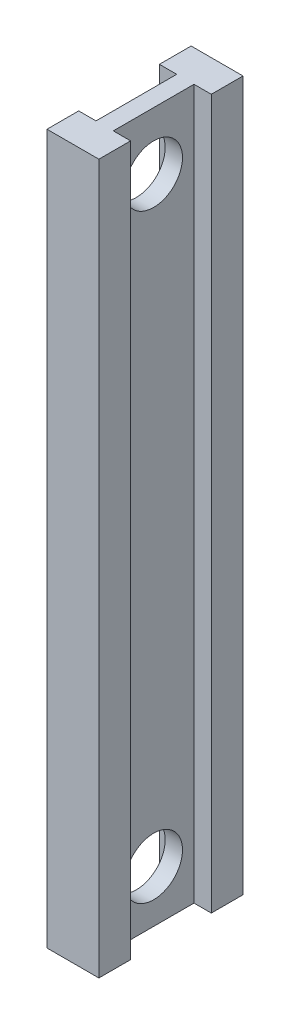
ISO-10303-21;
HEADER;
FILE_DESCRIPTION(('STEP AP214'),'2;1');
FILE_NAME('part.step','',(''),(''),'','','');
FILE_SCHEMA(('AUTOMOTIVE_DESIGN { 1 0 10303 214 1 1 1 1 }'));
ENDSEC;
DATA;
#1=APPLICATION_CONTEXT('core data for automotive mechanical design processes');
#2=APPLICATION_PROTOCOL_DEFINITION('international standard','automotive_design',2000,#1);
#3=PRODUCT_CONTEXT('',#1,'mechanical');
#4=PRODUCT('Part','Part','',(#3));
#5=PRODUCT_RELATED_PRODUCT_CATEGORY('part','',(#4));
#6=PRODUCT_DEFINITION_FORMATION('','',#4);
#7=PRODUCT_DEFINITION_CONTEXT('part definition',#1,'design');
#8=PRODUCT_DEFINITION('design','',#6,#7);
#9=PRODUCT_DEFINITION_SHAPE('','',#8);
#10=(LENGTH_UNIT() NAMED_UNIT(*) SI_UNIT(.MILLI.,.METRE.));
#11=(NAMED_UNIT(*) PLANE_ANGLE_UNIT() SI_UNIT($,.RADIAN.));
#12=(NAMED_UNIT(*) SI_UNIT($,.STERADIAN.) SOLID_ANGLE_UNIT());
#13=UNCERTAINTY_MEASURE_WITH_UNIT(LENGTH_MEASURE(1.E-05),#10,'distance_accuracy_value','');
#14=(GEOMETRIC_REPRESENTATION_CONTEXT(3) GLOBAL_UNCERTAINTY_ASSIGNED_CONTEXT((#13)) GLOBAL_UNIT_ASSIGNED_CONTEXT((#10,
#11,#12)) REPRESENTATION_CONTEXT('',''));
#15=CARTESIAN_POINT('',(0.,0.,0.));
#16=DIRECTION('',(0.,0.,1.));
#17=DIRECTION('',(1.,0.,0.));
#18=AXIS2_PLACEMENT_3D('',#15,#16,#17);
#19=CARTESIAN_POINT('',(33.7500000000001,1076.28491328611,52.5));
#20=DIRECTION('',(-1.,0.,0.));
#21=DIRECTION('',(0.,0.,1.));
#22=AXIS2_PLACEMENT_3D('',#19,#20,#21);
#23=PLANE('',#22);
#24=DIRECTION('',(0.,0.,-1.));
#25=VECTOR('',#24,1.);
#26=CARTESIAN_POINT('',(33.7500000000001,153.784913286111,52.5));
#27=LINE('',#26,#25);
#28=CARTESIAN_POINT('',(33.75,153.784913286111,93.75));
#29=VERTEX_POINT('',#28);
#30=CARTESIAN_POINT('',(33.7500000000001,153.784913286111,52.5));
#31=VERTEX_POINT('',#30);
#32=EDGE_CURVE('E168',#29,#31,#27,.T.);
#33=ORIENTED_EDGE('',*,*,#32,.T.);
#34=DIRECTION('',(0.,-1.,0.));
#35=VECTOR('',#34,1.);
#36=CARTESIAN_POINT('',(33.7500000000001,1076.28491328611,52.5));
#37=LINE('',#36,#35);
#38=CARTESIAN_POINT('',(33.7500000000001,1076.28491328611,52.5));
#39=VERTEX_POINT('',#38);
#40=EDGE_CURVE('E12',#39,#31,#37,.T.);
#41=ORIENTED_EDGE('',*,*,#40,.F.);
#42=DIRECTION('',(0.,0.,-1.));
#43=VECTOR('',#42,1.);
#44=CARTESIAN_POINT('',(33.7500000000001,1076.28491328611,52.5));
#45=LINE('',#44,#43);
#46=CARTESIAN_POINT('',(33.75,1076.28491328611,93.75));
#47=VERTEX_POINT('',#46);
#48=EDGE_CURVE('E195',#47,#39,#45,.T.);
#49=ORIENTED_EDGE('',*,*,#48,.F.);
#50=DIRECTION('',(0.,-1.,0.));
#51=VECTOR('',#50,1.);
#52=CARTESIAN_POINT('',(33.75,1076.28491328611,93.75));
#53=LINE('',#52,#51);
#54=EDGE_CURVE('E167',#47,#29,#53,.T.);
#55=ORIENTED_EDGE('',*,*,#54,.T.);
#56=EDGE_LOOP('',(#33,#41,#49,#55));
#57=FACE_BOUND('',#56,.T.);
#58=ADVANCED_FACE('F48',(#57),#23,.F.);
#59=CARTESIAN_POINT('',(33.7500000000001,1076.28491328611,52.5));
#60=DIRECTION('',(0.,0.,1.));
#61=DIRECTION('',(1.,0.,0.));
#62=AXIS2_PLACEMENT_3D('',#59,#60,#61);
#63=PLANE('',#62);
#64=DIRECTION('',(-1.,0.,0.));
#65=VECTOR('',#64,1.);
#66=CARTESIAN_POINT('',(33.7500000000001,153.784913286111,52.5));
#67=LINE('',#66,#65);
#68=CARTESIAN_POINT('',(11.25,153.784913286111,52.5));
#69=VERTEX_POINT('',#68);
#70=EDGE_CURVE('E175',#31,#69,#67,.T.);
#71=ORIENTED_EDGE('',*,*,#70,.T.);
#72=DIRECTION('',(0.,-1.,0.));
#73=VECTOR('',#72,1.);
#74=CARTESIAN_POINT('',(11.25,1076.28491328611,52.5));
#75=LINE('',#74,#73);
#76=CARTESIAN_POINT('',(11.25,1076.28491328611,52.5));
#77=VERTEX_POINT('',#76);
#78=EDGE_CURVE('E60',#77,#69,#75,.T.);
#79=ORIENTED_EDGE('',*,*,#78,.F.);
#80=DIRECTION('',(-1.,0.,0.));
#81=VECTOR('',#80,1.);
#82=CARTESIAN_POINT('',(33.7500000000001,1076.28491328611,52.5));
#83=LINE('',#82,#81);
#84=EDGE_CURVE('E124',#39,#77,#83,.T.);
#85=ORIENTED_EDGE('',*,*,#84,.F.);
#86=ORIENTED_EDGE('',*,*,#40,.T.);
#87=EDGE_LOOP('',(#71,#79,#85,#86));
#88=FACE_BOUND('',#87,.T.);
#89=ADVANCED_FACE('F268',(#88),#63,.F.);
#90=CARTESIAN_POINT('',(11.25,1076.28491328611,-52.5));
#91=DIRECTION('',(-1.,0.,0.));
#92=DIRECTION('',(0.,0.,1.));
#93=AXIS2_PLACEMENT_3D('',#90,#91,#92);
#94=PLANE('',#93);
#95=CARTESIAN_POINT('',(11.25,1001.28491328611,0.));
#96=DIRECTION('',(1.,0.,0.));
#97=DIRECTION('',(0.,0.,-1.));
#98=AXIS2_PLACEMENT_3D('',#95,#96,#97);
#99=CIRCLE('',#98,37.5);
#100=CARTESIAN_POINT('',(11.25,1001.28491328611,-37.5));
#101=VERTEX_POINT('',#100);
#102=EDGE_CURVE('E223',#101,#101,#99,.T.);
#103=ORIENTED_EDGE('',*,*,#102,.F.);
#104=EDGE_LOOP('',(#103));
#105=FACE_BOUND('',#104,.T.);
#106=CARTESIAN_POINT('',(11.25,221.284913286111,0.));
#107=DIRECTION('',(1.,0.,0.));
#108=DIRECTION('',(0.,0.,-1.));
#109=AXIS2_PLACEMENT_3D('',#106,#107,#108);
#110=CIRCLE('',#109,37.5);
#111=CARTESIAN_POINT('',(11.25,221.284913286111,-37.5));
#112=VERTEX_POINT('',#111);
#113=EDGE_CURVE('E220',#112,#112,#110,.T.);
#114=ORIENTED_EDGE('',*,*,#113,.F.);
#115=EDGE_LOOP('',(#114));
#116=FACE_BOUND('',#115,.T.);
#117=DIRECTION('',(0.,0.,-1.));
#118=VECTOR('',#117,1.);
#119=CARTESIAN_POINT('',(11.25,153.784913286111,-52.5));
#120=LINE('',#119,#118);
#121=CARTESIAN_POINT('',(11.25,153.784913286111,-52.5));
#122=VERTEX_POINT('',#121);
#123=EDGE_CURVE('E179',#69,#122,#120,.T.);
#124=ORIENTED_EDGE('',*,*,#123,.T.);
#125=DIRECTION('',(0.,-1.,0.));
#126=VECTOR('',#125,1.);
#127=CARTESIAN_POINT('',(11.25,1076.28491328611,-52.5));
#128=LINE('',#127,#126);
#129=CARTESIAN_POINT('',(11.25,1076.28491328611,-52.5));
#130=VERTEX_POINT('',#129);
#131=EDGE_CURVE('E215',#130,#122,#128,.T.);
#132=ORIENTED_EDGE('',*,*,#131,.F.);
#133=DIRECTION('',(0.,0.,-1.));
#134=VECTOR('',#133,1.);
#135=CARTESIAN_POINT('',(11.25,1076.28491328611,-52.5));
#136=LINE('',#135,#134);
#137=EDGE_CURVE('E228',#77,#130,#136,.T.);
#138=ORIENTED_EDGE('',*,*,#137,.F.);
#139=ORIENTED_EDGE('',*,*,#78,.T.);
#140=EDGE_LOOP('',(#124,#132,#138,#139));
#141=FACE_BOUND('',#140,.T.);
#142=ADVANCED_FACE('F275',(#105,#116,#141),#94,.F.);
#143=CARTESIAN_POINT('',(33.75,1076.28491328611,-52.5));
#144=DIRECTION('',(0.,0.,-1.));
#145=DIRECTION('',(-1.,0.,0.));
#146=AXIS2_PLACEMENT_3D('',#143,#144,#145);
#147=PLANE('',#146);
#148=DIRECTION('',(1.,0.,0.));
#149=VECTOR('',#148,1.);
#150=CARTESIAN_POINT('',(33.75,153.784913286111,-52.5));
#151=LINE('',#150,#149);
#152=CARTESIAN_POINT('',(33.75,153.784913286111,-52.5));
#153=VERTEX_POINT('',#152);
#154=EDGE_CURVE('E180',#122,#153,#151,.T.);
#155=ORIENTED_EDGE('',*,*,#154,.T.);
#156=DIRECTION('',(0.,-1.,0.));
#157=VECTOR('',#156,1.);
#158=CARTESIAN_POINT('',(33.75,1076.28491328611,-52.5));
#159=LINE('',#158,#157);
#160=CARTESIAN_POINT('',(33.75,1076.28491328611,-52.5));
#161=VERTEX_POINT('',#160);
#162=EDGE_CURVE('E207',#161,#153,#159,.T.);
#163=ORIENTED_EDGE('',*,*,#162,.F.);
#164=DIRECTION('',(1.,0.,0.));
#165=VECTOR('',#164,1.);
#166=CARTESIAN_POINT('',(33.75,1076.28491328611,-52.5));
#167=LINE('',#166,#165);
#168=EDGE_CURVE('E231',#130,#161,#167,.T.);
#169=ORIENTED_EDGE('',*,*,#168,.F.);
#170=ORIENTED_EDGE('',*,*,#131,.T.);
#171=EDGE_LOOP('',(#155,#163,#169,#170));
#172=FACE_BOUND('',#171,.T.);
#173=ADVANCED_FACE('F277',(#172),#147,.F.);
#174=CARTESIAN_POINT('',(33.75,1076.28491328611,-93.75));
#175=DIRECTION('',(-1.,0.,0.));
#176=DIRECTION('',(0.,0.,1.));
#177=AXIS2_PLACEMENT_3D('',#174,#175,#176);
#178=PLANE('',#177);
#179=DIRECTION('',(0.,0.,-1.));
#180=VECTOR('',#179,1.);
#181=CARTESIAN_POINT('',(33.75,153.784913286111,-93.75));
#182=LINE('',#181,#180);
#183=CARTESIAN_POINT('',(33.75,153.784913286111,-93.75));
#184=VERTEX_POINT('',#183);
#185=EDGE_CURVE('E177',#153,#184,#182,.T.);
#186=ORIENTED_EDGE('',*,*,#185,.T.);
#187=DIRECTION('',(0.,-1.,0.));
#188=VECTOR('',#187,1.);
#189=CARTESIAN_POINT('',(33.75,1076.28491328611,-93.75));
#190=LINE('',#189,#188);
#191=CARTESIAN_POINT('',(33.75,1076.28491328611,-93.75));
#192=VERTEX_POINT('',#191);
#193=EDGE_CURVE('E206',#192,#184,#190,.T.);
#194=ORIENTED_EDGE('',*,*,#193,.F.);
#195=DIRECTION('',(0.,0.,-1.));
#196=VECTOR('',#195,1.);
#197=CARTESIAN_POINT('',(33.75,1076.28491328611,-93.75));
#198=LINE('',#197,#196);
#199=EDGE_CURVE('E233',#161,#192,#198,.T.);
#200=ORIENTED_EDGE('',*,*,#199,.F.);
#201=ORIENTED_EDGE('',*,*,#162,.T.);
#202=EDGE_LOOP('',(#186,#194,#200,#201));
#203=FACE_BOUND('',#202,.T.);
#204=ADVANCED_FACE('F284',(#203),#178,.F.);
#205=CARTESIAN_POINT('',(-33.75,1076.28491328611,-93.75));
#206=DIRECTION('',(0.,0.,1.));
#207=DIRECTION('',(1.,0.,0.));
#208=AXIS2_PLACEMENT_3D('',#205,#206,#207);
#209=PLANE('',#208);
#210=DIRECTION('',(-1.,0.,0.));
#211=VECTOR('',#210,1.);
#212=CARTESIAN_POINT('',(-33.75,153.784913286111,-93.75));
#213=LINE('',#212,#211);
#214=CARTESIAN_POINT('',(-33.75,153.784913286111,-93.75));
#215=VERTEX_POINT('',#214);
#216=EDGE_CURVE('E185',#184,#215,#213,.T.);
#217=ORIENTED_EDGE('',*,*,#216,.T.);
#218=DIRECTION('',(0.,-1.,0.));
#219=VECTOR('',#218,1.);
#220=CARTESIAN_POINT('',(-33.75,1076.28491328611,-93.75));
#221=LINE('',#220,#219);
#222=CARTESIAN_POINT('',(-33.75,1076.28491328611,-93.75));
#223=VERTEX_POINT('',#222);
#224=EDGE_CURVE('E201',#223,#215,#221,.T.);
#225=ORIENTED_EDGE('',*,*,#224,.F.);
#226=DIRECTION('',(-1.,0.,0.));
#227=VECTOR('',#226,1.);
#228=CARTESIAN_POINT('',(-33.75,1076.28491328611,-93.75));
#229=LINE('',#228,#227);
#230=EDGE_CURVE('E237',#192,#223,#229,.T.);
#231=ORIENTED_EDGE('',*,*,#230,.F.);
#232=ORIENTED_EDGE('',*,*,#193,.T.);
#233=EDGE_LOOP('',(#217,#225,#231,#232));
#234=FACE_BOUND('',#233,.T.);
#235=ADVANCED_FACE('F283',(#234),#209,.F.);
#236=CARTESIAN_POINT('',(-33.75,1076.28491328611,-93.75));
#237=DIRECTION('',(1.,0.,0.));
#238=DIRECTION('',(0.,0.,-1.));
#239=AXIS2_PLACEMENT_3D('',#236,#237,#238);
#240=PLANE('',#239);
#241=DIRECTION('',(0.,0.,1.));
#242=VECTOR('',#241,1.);
#243=CARTESIAN_POINT('',(-33.75,153.784913286111,-93.75));
#244=LINE('',#243,#242);
#245=CARTESIAN_POINT('',(-33.75,153.784913286111,-52.5));
#246=VERTEX_POINT('',#245);
#247=EDGE_CURVE('E184',#215,#246,#244,.T.);
#248=ORIENTED_EDGE('',*,*,#247,.T.);
#249=DIRECTION('',(0.,-1.,0.));
#250=VECTOR('',#249,1.);
#251=CARTESIAN_POINT('',(-33.75,1076.28491328611,-52.5));
#252=LINE('',#251,#250);
#253=CARTESIAN_POINT('',(-33.75,1076.28491328611,-52.5));
#254=VERTEX_POINT('',#253);
#255=EDGE_CURVE('E199',#254,#246,#252,.T.);
#256=ORIENTED_EDGE('',*,*,#255,.F.);
#257=DIRECTION('',(0.,0.,1.));
#258=VECTOR('',#257,1.);
#259=CARTESIAN_POINT('',(-33.75,1076.28491328611,-93.75));
#260=LINE('',#259,#258);
#261=EDGE_CURVE('E236',#223,#254,#260,.T.);
#262=ORIENTED_EDGE('',*,*,#261,.F.);
#263=ORIENTED_EDGE('',*,*,#224,.T.);
#264=EDGE_LOOP('',(#248,#256,#262,#263));
#265=FACE_BOUND('',#264,.T.);
#266=ADVANCED_FACE('F288',(#265),#240,.F.);
#267=CARTESIAN_POINT('',(-33.75,1076.28491328611,-52.5));
#268=DIRECTION('',(0.,0.,-1.));
#269=DIRECTION('',(-1.,0.,0.));
#270=AXIS2_PLACEMENT_3D('',#267,#268,#269);
#271=PLANE('',#270);
#272=DIRECTION('',(1.,0.,0.));
#273=VECTOR('',#272,1.);
#274=CARTESIAN_POINT('',(-33.75,153.784913286111,-52.5));
#275=LINE('',#274,#273);
#276=CARTESIAN_POINT('',(-11.25,153.784913286111,-52.5));
#277=VERTEX_POINT('',#276);
#278=EDGE_CURVE('E187',#246,#277,#275,.T.);
#279=ORIENTED_EDGE('',*,*,#278,.T.);
#280=DIRECTION('',(0.,-1.,0.));
#281=VECTOR('',#280,1.);
#282=CARTESIAN_POINT('',(-11.25,1076.28491328611,-52.5));
#283=LINE('',#282,#281);
#284=CARTESIAN_POINT('',(-11.25,1076.28491328611,-52.5));
#285=VERTEX_POINT('',#284);
#286=EDGE_CURVE('E197',#285,#277,#283,.T.);
#287=ORIENTED_EDGE('',*,*,#286,.F.);
#288=DIRECTION('',(1.,0.,0.));
#289=VECTOR('',#288,1.);
#290=CARTESIAN_POINT('',(-33.75,1076.28491328611,-52.5));
#291=LINE('',#290,#289);
#292=EDGE_CURVE('E238',#254,#285,#291,.T.);
#293=ORIENTED_EDGE('',*,*,#292,.F.);
#294=ORIENTED_EDGE('',*,*,#255,.T.);
#295=EDGE_LOOP('',(#279,#287,#293,#294));
#296=FACE_BOUND('',#295,.T.);
#297=ADVANCED_FACE('F249',(#296),#271,.F.);
#298=CARTESIAN_POINT('',(-11.25,1076.28491328611,-52.5));
#299=DIRECTION('',(1.,0.,0.));
#300=DIRECTION('',(0.,0.,-1.));
#301=AXIS2_PLACEMENT_3D('',#298,#299,#300);
#302=PLANE('',#301);
#303=CARTESIAN_POINT('',(-11.2499999999999,1001.28491328611,0.));
#304=DIRECTION('',(1.,0.,0.));
#305=DIRECTION('',(0.,0.,-1.));
#306=AXIS2_PLACEMENT_3D('',#303,#304,#305);
#307=CIRCLE('',#306,37.5);
#308=CARTESIAN_POINT('',(-11.2499999999999,1001.28491328611,-37.5));
#309=VERTEX_POINT('',#308);
#310=EDGE_CURVE('E51',#309,#309,#307,.T.);
#311=ORIENTED_EDGE('',*,*,#310,.T.);
#312=EDGE_LOOP('',(#311));
#313=FACE_BOUND('',#312,.T.);
#314=CARTESIAN_POINT('',(-11.2499999999999,221.284913286111,0.));
#315=DIRECTION('',(1.,0.,0.));
#316=DIRECTION('',(0.,0.,-1.));
#317=AXIS2_PLACEMENT_3D('',#314,#315,#316);
#318=CIRCLE('',#317,37.5);
#319=CARTESIAN_POINT('',(-11.2499999999999,221.284913286111,-37.5));
#320=VERTEX_POINT('',#319);
#321=EDGE_CURVE('E171',#320,#320,#318,.T.);
#322=ORIENTED_EDGE('',*,*,#321,.T.);
#323=EDGE_LOOP('',(#322));
#324=FACE_BOUND('',#323,.T.);
#325=DIRECTION('',(0.,0.,1.));
#326=VECTOR('',#325,1.);
#327=CARTESIAN_POINT('',(-11.25,153.784913286111,-52.5));
#328=LINE('',#327,#326);
#329=CARTESIAN_POINT('',(-11.25,153.784913286111,52.5));
#330=VERTEX_POINT('',#329);
#331=EDGE_CURVE('E190',#277,#330,#328,.T.);
#332=ORIENTED_EDGE('',*,*,#331,.T.);
#333=DIRECTION('',(0.,-1.,0.));
#334=VECTOR('',#333,1.);
#335=CARTESIAN_POINT('',(-11.25,1076.28491328611,52.5));
#336=LINE('',#335,#334);
#337=CARTESIAN_POINT('',(-11.25,1076.28491328611,52.5));
#338=VERTEX_POINT('',#337);
#339=EDGE_CURVE('E161',#338,#330,#336,.T.);
#340=ORIENTED_EDGE('',*,*,#339,.F.);
#341=DIRECTION('',(0.,0.,1.));
#342=VECTOR('',#341,1.);
#343=CARTESIAN_POINT('',(-11.25,1076.28491328611,-52.5));
#344=LINE('',#343,#342);
#345=EDGE_CURVE('E155',#285,#338,#344,.T.);
#346=ORIENTED_EDGE('',*,*,#345,.F.);
#347=ORIENTED_EDGE('',*,*,#286,.T.);
#348=EDGE_LOOP('',(#332,#340,#346,#347));
#349=FACE_BOUND('',#348,.T.);
#350=ADVANCED_FACE('F247',(#313,#324,#349),#302,.F.);
#351=CARTESIAN_POINT('',(-33.75,1076.28491328611,52.5));
#352=DIRECTION('',(0.,0.,1.));
#353=DIRECTION('',(1.,0.,0.));
#354=AXIS2_PLACEMENT_3D('',#351,#352,#353);
#355=PLANE('',#354);
#356=DIRECTION('',(-1.,0.,0.));
#357=VECTOR('',#356,1.);
#358=CARTESIAN_POINT('',(-33.75,153.784913286111,52.5));
#359=LINE('',#358,#357);
#360=CARTESIAN_POINT('',(-33.75,153.784913286111,52.5));
#361=VERTEX_POINT('',#360);
#362=EDGE_CURVE('E159',#330,#361,#359,.T.);
#363=ORIENTED_EDGE('',*,*,#362,.T.);
#364=DIRECTION('',(0.,-1.,0.));
#365=VECTOR('',#364,1.);
#366=CARTESIAN_POINT('',(-33.75,1076.28491328611,52.5));
#367=LINE('',#366,#365);
#368=CARTESIAN_POINT('',(-33.75,1076.28491328611,52.5));
#369=VERTEX_POINT('',#368);
#370=EDGE_CURVE('E160',#369,#361,#367,.T.);
#371=ORIENTED_EDGE('',*,*,#370,.F.);
#372=DIRECTION('',(-1.,0.,0.));
#373=VECTOR('',#372,1.);
#374=CARTESIAN_POINT('',(-33.75,1076.28491328611,52.5));
#375=LINE('',#374,#373);
#376=EDGE_CURVE('E148',#338,#369,#375,.T.);
#377=ORIENTED_EDGE('',*,*,#376,.F.);
#378=ORIENTED_EDGE('',*,*,#339,.T.);
#379=EDGE_LOOP('',(#363,#371,#377,#378));
#380=FACE_BOUND('',#379,.T.);
#381=ADVANCED_FACE('F158',(#380),#355,.F.);
#382=CARTESIAN_POINT('',(-33.75,1076.28491328611,52.5));
#383=DIRECTION('',(1.,0.,0.));
#384=DIRECTION('',(0.,0.,-1.));
#385=AXIS2_PLACEMENT_3D('',#382,#383,#384);
#386=PLANE('',#385);
#387=DIRECTION('',(0.,0.,1.));
#388=VECTOR('',#387,1.);
#389=CARTESIAN_POINT('',(-33.75,153.784913286111,52.5));
#390=LINE('',#389,#388);
#391=CARTESIAN_POINT('',(-33.75,153.784913286111,93.75));
#392=VERTEX_POINT('',#391);
#393=EDGE_CURVE('E110',#361,#392,#390,.T.);
#394=ORIENTED_EDGE('',*,*,#393,.T.);
#395=DIRECTION('',(0.,-1.,0.));
#396=VECTOR('',#395,1.);
#397=CARTESIAN_POINT('',(-33.75,1076.28491328611,93.75));
#398=LINE('',#397,#396);
#399=CARTESIAN_POINT('',(-33.75,1076.28491328611,93.75));
#400=VERTEX_POINT('',#399);
#401=EDGE_CURVE('E165',#400,#392,#398,.T.);
#402=ORIENTED_EDGE('',*,*,#401,.F.);
#403=DIRECTION('',(0.,0.,1.));
#404=VECTOR('',#403,1.);
#405=CARTESIAN_POINT('',(-33.75,1076.28491328611,52.5));
#406=LINE('',#405,#404);
#407=EDGE_CURVE('E147',#369,#400,#406,.T.);
#408=ORIENTED_EDGE('',*,*,#407,.F.);
#409=ORIENTED_EDGE('',*,*,#370,.T.);
#410=EDGE_LOOP('',(#394,#402,#408,#409));
#411=FACE_BOUND('',#410,.T.);
#412=ADVANCED_FACE('F163',(#411),#386,.F.);
#413=CARTESIAN_POINT('',(-33.75,1076.28491328611,93.75));
#414=DIRECTION('',(0.,0.,-1.));
#415=DIRECTION('',(-1.,0.,0.));
#416=AXIS2_PLACEMENT_3D('',#413,#414,#415);
#417=PLANE('',#416);
#418=DIRECTION('',(1.,0.,0.));
#419=VECTOR('',#418,1.);
#420=CARTESIAN_POINT('',(-33.75,153.784913286111,93.75));
#421=LINE('',#420,#419);
#422=EDGE_CURVE('E114',#392,#29,#421,.T.);
#423=ORIENTED_EDGE('',*,*,#422,.T.);
#424=ORIENTED_EDGE('',*,*,#54,.F.);
#425=DIRECTION('',(1.,0.,0.));
#426=VECTOR('',#425,1.);
#427=CARTESIAN_POINT('',(-33.75,1076.28491328611,93.75));
#428=LINE('',#427,#426);
#429=EDGE_CURVE('E69',#400,#47,#428,.T.);
#430=ORIENTED_EDGE('',*,*,#429,.F.);
#431=ORIENTED_EDGE('',*,*,#401,.T.);
#432=EDGE_LOOP('',(#423,#424,#430,#431));
#433=FACE_BOUND('',#432,.T.);
#434=ADVANCED_FACE('F256',(#433),#417,.F.);
#435=CARTESIAN_POINT('',(0.,1076.28491328611,0.));
#436=DIRECTION('',(0.,1.,0.));
#437=DIRECTION('',(0.,0.,1.));
#438=AXIS2_PLACEMENT_3D('',#435,#436,#437);
#439=PLANE('',#438);
#440=ORIENTED_EDGE('',*,*,#48,.T.);
#441=ORIENTED_EDGE('',*,*,#84,.T.);
#442=ORIENTED_EDGE('',*,*,#137,.T.);
#443=ORIENTED_EDGE('',*,*,#168,.T.);
#444=ORIENTED_EDGE('',*,*,#199,.T.);
#445=ORIENTED_EDGE('',*,*,#230,.T.);
#446=ORIENTED_EDGE('',*,*,#261,.T.);
#447=ORIENTED_EDGE('',*,*,#292,.T.);
#448=ORIENTED_EDGE('',*,*,#345,.T.);
#449=ORIENTED_EDGE('',*,*,#376,.T.);
#450=ORIENTED_EDGE('',*,*,#407,.T.);
#451=ORIENTED_EDGE('',*,*,#429,.T.);
#452=EDGE_LOOP('',(#440,#441,#442,#443,#444,#445,#446,#447,#448,#449,#450,#451));
#453=FACE_BOUND('',#452,.T.);
#454=ADVANCED_FACE('F146',(#453),#439,.T.);
#455=CARTESIAN_POINT('',(0.,153.784913286111,0.));
#456=DIRECTION('',(0.,1.,0.));
#457=DIRECTION('',(0.,0.,1.));
#458=AXIS2_PLACEMENT_3D('',#455,#456,#457);
#459=PLANE('',#458);
#460=ORIENTED_EDGE('',*,*,#32,.F.);
#461=ORIENTED_EDGE('',*,*,#422,.F.);
#462=ORIENTED_EDGE('',*,*,#393,.F.);
#463=ORIENTED_EDGE('',*,*,#362,.F.);
#464=ORIENTED_EDGE('',*,*,#331,.F.);
#465=ORIENTED_EDGE('',*,*,#278,.F.);
#466=ORIENTED_EDGE('',*,*,#247,.F.);
#467=ORIENTED_EDGE('',*,*,#216,.F.);
#468=ORIENTED_EDGE('',*,*,#185,.F.);
#469=ORIENTED_EDGE('',*,*,#154,.F.);
#470=ORIENTED_EDGE('',*,*,#123,.F.);
#471=ORIENTED_EDGE('',*,*,#70,.F.);
#472=EDGE_LOOP('',(#460,#461,#462,#463,#464,#465,#466,#467,#468,#469,#470,#471));
#473=FACE_BOUND('',#472,.T.);
#474=ADVANCED_FACE('F251',(#473),#459,.F.);
#475=CARTESIAN_POINT('',(-888.75,221.284913286111,1.11769980537616E-13));
#476=DIRECTION('',(1.,0.,0.));
#477=DIRECTION('',(0.,0.,-1.));
#478=AXIS2_PLACEMENT_3D('',#475,#476,#477);
#479=CYLINDRICAL_SURFACE('',#478,37.5);
#480=ORIENTED_EDGE('',*,*,#113,.T.);
#481=EDGE_LOOP('',(#480));
#482=FACE_BOUND('',#481,.T.);
#483=ORIENTED_EDGE('',*,*,#321,.F.);
#484=EDGE_LOOP('',(#483));
#485=FACE_BOUND('',#484,.T.);
#486=ADVANCED_FACE('F314',(#482,#485),#479,.F.);
#487=CARTESIAN_POINT('',(-888.75,1001.28491328611,1.11769980537616E-13));
#488=DIRECTION('',(1.,0.,0.));
#489=DIRECTION('',(0.,0.,-1.));
#490=AXIS2_PLACEMENT_3D('',#487,#488,#489);
#491=CYLINDRICAL_SURFACE('',#490,37.5);
#492=ORIENTED_EDGE('',*,*,#102,.T.);
#493=EDGE_LOOP('',(#492));
#494=FACE_BOUND('',#493,.T.);
#495=ORIENTED_EDGE('',*,*,#310,.F.);
#496=EDGE_LOOP('',(#495));
#497=FACE_BOUND('',#496,.T.);
#498=ADVANCED_FACE('F313',(#494,#497),#491,.F.);
#499=CLOSED_SHELL('',(#58,#89,#142,#173,#204,#235,#266,#297,#350,#381,#412,#434,#454,#474,#486,#498));
#500=MANIFOLD_SOLID_BREP('B2',#499);
#501=ADVANCED_BREP_SHAPE_REPRESENTATION('',(#18,#500),#14);
#502=SHAPE_DEFINITION_REPRESENTATION(#9,#501);
ENDSEC;
END-ISO-10303-21;
